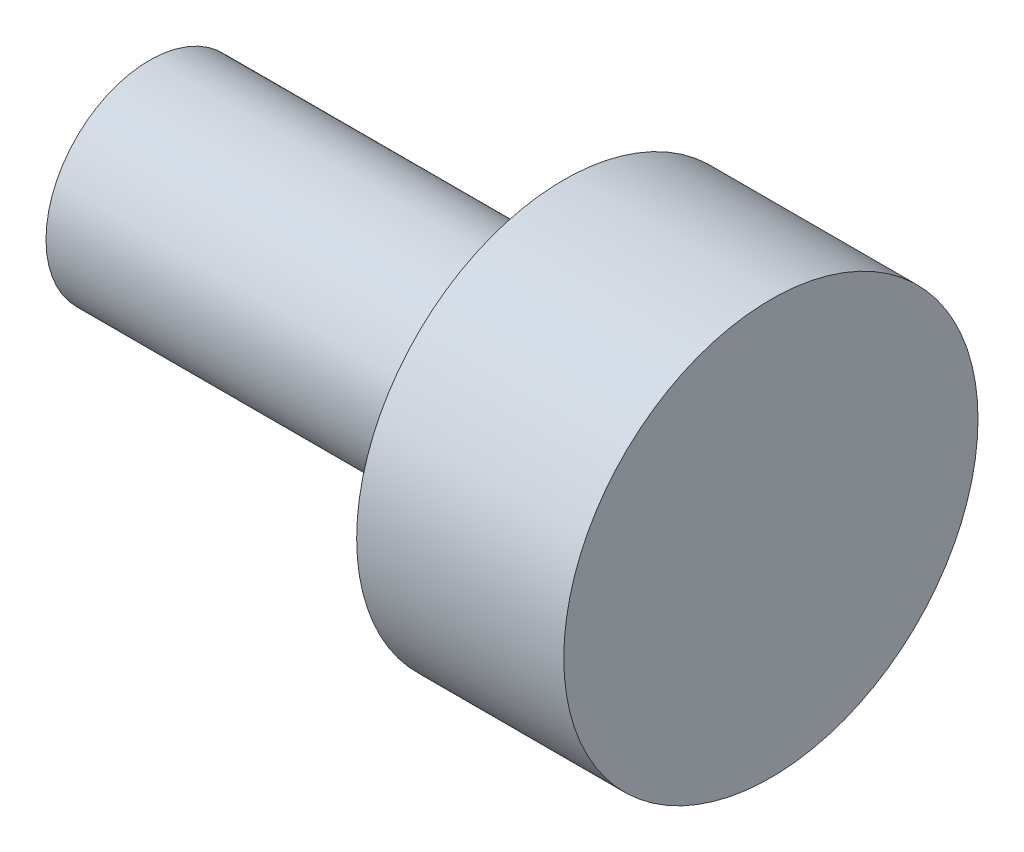
ISO-10303-21;
HEADER;
FILE_DESCRIPTION(('STEP AP214'),'2;1');
FILE_NAME('part.step','',(''),(''),'','','');
FILE_SCHEMA(('AUTOMOTIVE_DESIGN { 1 0 10303 214 1 1 1 1 }'));
ENDSEC;
DATA;
#1=APPLICATION_CONTEXT('core data for automotive mechanical design processes');
#2=APPLICATION_PROTOCOL_DEFINITION('international standard','automotive_design',2000,#1);
#3=PRODUCT_CONTEXT('',#1,'mechanical');
#4=PRODUCT('Part','Part','',(#3));
#5=PRODUCT_RELATED_PRODUCT_CATEGORY('part','',(#4));
#6=PRODUCT_DEFINITION_FORMATION('','',#4);
#7=PRODUCT_DEFINITION_CONTEXT('part definition',#1,'design');
#8=PRODUCT_DEFINITION('design','',#6,#7);
#9=PRODUCT_DEFINITION_SHAPE('','',#8);
#10=(LENGTH_UNIT() NAMED_UNIT(*) SI_UNIT(.MILLI.,.METRE.));
#11=(NAMED_UNIT(*) PLANE_ANGLE_UNIT() SI_UNIT($,.RADIAN.));
#12=(NAMED_UNIT(*) SI_UNIT($,.STERADIAN.) SOLID_ANGLE_UNIT());
#13=UNCERTAINTY_MEASURE_WITH_UNIT(LENGTH_MEASURE(1.E-05),#10,'distance_accuracy_value','');
#14=(GEOMETRIC_REPRESENTATION_CONTEXT(3) GLOBAL_UNCERTAINTY_ASSIGNED_CONTEXT((#13)) GLOBAL_UNIT_ASSIGNED_CONTEXT((#10,
#11,#12)) REPRESENTATION_CONTEXT('',''));
#15=CARTESIAN_POINT('',(0.,0.,0.));
#16=DIRECTION('',(0.,0.,1.));
#17=DIRECTION('',(1.,0.,0.));
#18=AXIS2_PLACEMENT_3D('',#15,#16,#17);
#19=CARTESIAN_POINT('',(-116.835752997229,26.1754045737225,0.));
#20=DIRECTION('',(-1.,0.,0.));
#21=DIRECTION('',(0.,0.,1.));
#22=AXIS2_PLACEMENT_3D('',#19,#20,#21);
#23=CYLINDRICAL_SURFACE('',#22,1.);
#24=CARTESIAN_POINT('',(-105.835752997229,26.1754045737225,0.));
#25=DIRECTION('',(-1.,0.,0.));
#26=DIRECTION('',(0.,0.,1.));
#27=AXIS2_PLACEMENT_3D('',#24,#25,#26);
#28=CIRCLE('',#27,1.);
#29=CARTESIAN_POINT('',(-105.835752997229,26.1754045737225,1.));
#30=VERTEX_POINT('',#29);
#31=EDGE_CURVE('E10',#30,#30,#28,.T.);
#32=ORIENTED_EDGE('',*,*,#31,.T.);
#33=EDGE_LOOP('',(#32));
#34=FACE_BOUND('',#33,.T.);
#35=CARTESIAN_POINT('',(-109.835752997229,26.1754045737225,0.));
#36=DIRECTION('',(-1.,0.,0.));
#37=DIRECTION('',(0.,0.,1.));
#38=AXIS2_PLACEMENT_3D('',#35,#36,#37);
#39=CIRCLE('',#38,1.);
#40=CARTESIAN_POINT('',(-109.835752997229,26.1754045737225,1.));
#41=VERTEX_POINT('',#40);
#42=EDGE_CURVE('E38',#41,#41,#39,.T.);
#43=ORIENTED_EDGE('',*,*,#42,.F.);
#44=EDGE_LOOP('',(#43));
#45=FACE_BOUND('',#44,.T.);
#46=ADVANCED_FACE('F35',(#34,#45),#23,.T.);
#47=CARTESIAN_POINT('',(-105.835752997229,27.1754045737225,0.));
#48=DIRECTION('',(1.,0.,0.));
#49=DIRECTION('',(0.,0.,-1.));
#50=AXIS2_PLACEMENT_3D('',#47,#48,#49);
#51=PLANE('',#50);
#52=ORIENTED_EDGE('',*,*,#31,.F.);
#53=EDGE_LOOP('',(#52));
#54=FACE_BOUND('',#53,.T.);
#55=CARTESIAN_POINT('',(-105.835752997229,26.1754045737225,0.));
#56=DIRECTION('',(-1.,0.,0.));
#57=DIRECTION('',(0.,0.,1.));
#58=AXIS2_PLACEMENT_3D('',#55,#56,#57);
#59=CIRCLE('',#58,2.);
#60=CARTESIAN_POINT('',(-105.835752997229,26.1754045737225,2.));
#61=VERTEX_POINT('',#60);
#62=EDGE_CURVE('E42',#61,#61,#59,.T.);
#63=ORIENTED_EDGE('',*,*,#62,.T.);
#64=EDGE_LOOP('',(#63));
#65=FACE_BOUND('',#64,.T.);
#66=ADVANCED_FACE('F58',(#54,#65),#51,.F.);
#67=CARTESIAN_POINT('',(-116.835752997229,26.1754045737225,0.));
#68=DIRECTION('',(-1.,0.,0.));
#69=DIRECTION('',(0.,0.,1.));
#70=AXIS2_PLACEMENT_3D('',#67,#68,#69);
#71=CYLINDRICAL_SURFACE('',#70,2.);
#72=ORIENTED_EDGE('',*,*,#62,.F.);
#73=EDGE_LOOP('',(#72));
#74=FACE_BOUND('',#73,.T.);
#75=CARTESIAN_POINT('',(-103.835752997229,26.1754045737225,0.));
#76=DIRECTION('',(-1.,0.,0.));
#77=DIRECTION('',(0.,0.,1.));
#78=AXIS2_PLACEMENT_3D('',#75,#76,#77);
#79=CIRCLE('',#78,2.);
#80=CARTESIAN_POINT('',(-103.835752997229,26.1754045737225,2.));
#81=VERTEX_POINT('',#80);
#82=EDGE_CURVE('E46',#81,#81,#79,.T.);
#83=ORIENTED_EDGE('',*,*,#82,.T.);
#84=EDGE_LOOP('',(#83));
#85=FACE_BOUND('',#84,.T.);
#86=ADVANCED_FACE('F62',(#74,#85),#71,.T.);
#87=CARTESIAN_POINT('',(-103.835752997229,28.1754045737225,0.));
#88=DIRECTION('',(-1.,0.,0.));
#89=DIRECTION('',(0.,0.,1.));
#90=AXIS2_PLACEMENT_3D('',#87,#88,#89);
#91=PLANE('',#90);
#92=ORIENTED_EDGE('',*,*,#82,.F.);
#93=EDGE_LOOP('',(#92));
#94=FACE_BOUND('',#93,.T.);
#95=ADVANCED_FACE('F67',(#94),#91,.F.);
#96=CARTESIAN_POINT('',(-109.835752997229,0.,0.));
#97=DIRECTION('',(-1.,0.,0.));
#98=DIRECTION('',(0.,0.,1.));
#99=AXIS2_PLACEMENT_3D('',#96,#97,#98);
#100=PLANE('',#99);
#101=ORIENTED_EDGE('',*,*,#42,.T.);
#102=EDGE_LOOP('',(#101));
#103=FACE_BOUND('',#102,.T.);
#104=ADVANCED_FACE('F55',(#103),#100,.T.);
#105=CLOSED_SHELL('',(#46,#66,#86,#95,#104));
#106=MANIFOLD_SOLID_BREP('B2',#105);
#107=ADVANCED_BREP_SHAPE_REPRESENTATION('',(#18,#106),#14);
#108=SHAPE_DEFINITION_REPRESENTATION(#9,#107);
ENDSEC;
END-ISO-10303-21;
